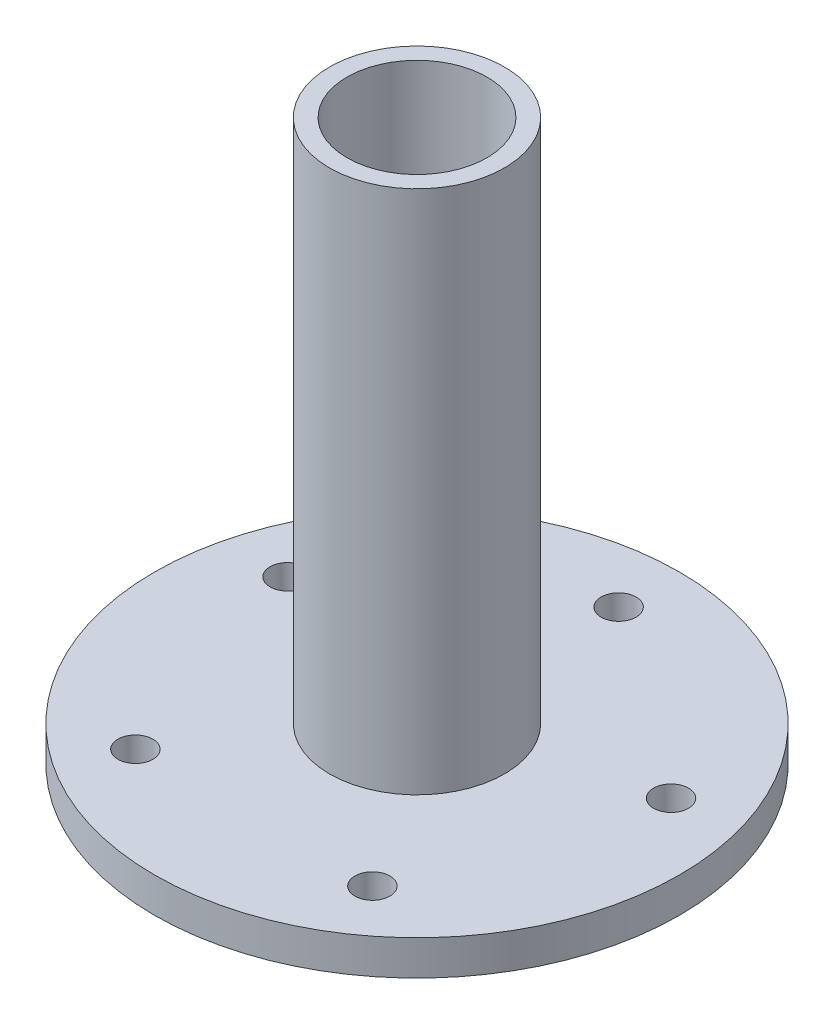
ISO-10303-21;
HEADER;
FILE_DESCRIPTION(('STEP AP214'),'2;1');
FILE_NAME('part.step','',(''),(''),'','','');
FILE_SCHEMA(('AUTOMOTIVE_DESIGN { 1 0 10303 214 1 1 1 1 }'));
ENDSEC;
DATA;
#1=APPLICATION_CONTEXT('core data for automotive mechanical design processes');
#2=APPLICATION_PROTOCOL_DEFINITION('international standard','automotive_design',2000,#1);
#3=PRODUCT_CONTEXT('',#1,'mechanical');
#4=PRODUCT('Part','Part','',(#3));
#5=PRODUCT_RELATED_PRODUCT_CATEGORY('part','',(#4));
#6=PRODUCT_DEFINITION_FORMATION('','',#4);
#7=PRODUCT_DEFINITION_CONTEXT('part definition',#1,'design');
#8=PRODUCT_DEFINITION('design','',#6,#7);
#9=PRODUCT_DEFINITION_SHAPE('','',#8);
#10=(LENGTH_UNIT() NAMED_UNIT(*) SI_UNIT(.MILLI.,.METRE.));
#11=(NAMED_UNIT(*) PLANE_ANGLE_UNIT() SI_UNIT($,.RADIAN.));
#12=(NAMED_UNIT(*) SI_UNIT($,.STERADIAN.) SOLID_ANGLE_UNIT());
#13=UNCERTAINTY_MEASURE_WITH_UNIT(LENGTH_MEASURE(1.E-05),#10,'distance_accuracy_value','');
#14=(GEOMETRIC_REPRESENTATION_CONTEXT(3) GLOBAL_UNCERTAINTY_ASSIGNED_CONTEXT((#13)) GLOBAL_UNIT_ASSIGNED_CONTEXT((#10,
#11,#12)) REPRESENTATION_CONTEXT('',''));
#15=CARTESIAN_POINT('',(0.,0.,0.));
#16=DIRECTION('',(0.,0.,1.));
#17=DIRECTION('',(1.,0.,0.));
#18=AXIS2_PLACEMENT_3D('',#15,#16,#17);
#19=CARTESIAN_POINT('',(0.,10.,0.));
#20=DIRECTION('',(0.,1.,0.));
#21=DIRECTION('',(0.,0.,1.));
#22=AXIS2_PLACEMENT_3D('',#19,#20,#21);
#23=PLANE('',#22);
#24=CARTESIAN_POINT('',(0.,10.,0.));
#25=DIRECTION('',(0.,1.,0.));
#26=DIRECTION('',(0.,0.,1.));
#27=AXIS2_PLACEMENT_3D('',#24,#25,#26);
#28=CIRCLE('',#27,75.);
#29=CARTESIAN_POINT('',(0.,10.,75.));
#30=VERTEX_POINT('',#29);
#31=EDGE_CURVE('E10',#30,#30,#28,.T.);
#32=ORIENTED_EDGE('',*,*,#31,.T.);
#33=EDGE_LOOP('',(#32));
#34=FACE_BOUND('',#33,.T.);
#35=CARTESIAN_POINT('',(-54.7949451338453,10.,-17.803956927986));
#36=DIRECTION('',(0.,1.,0.));
#37=DIRECTION('',(0.,0.,1.));
#38=AXIS2_PLACEMENT_3D('',#35,#36,#37);
#39=CIRCLE('',#38,5.00000000000292);
#40=CARTESIAN_POINT('',(-54.7949451338453,10.,-12.8039569279831));
#41=VERTEX_POINT('',#40);
#42=EDGE_CURVE('E51',#41,#41,#39,.T.);
#43=ORIENTED_EDGE('',*,*,#42,.F.);
#44=EDGE_LOOP('',(#43));
#45=FACE_BOUND('',#44,.T.);
#46=CARTESIAN_POINT('',(-33.8651385043987,10.,46.6113643717141));
#47=DIRECTION('',(0.,1.,0.));
#48=DIRECTION('',(0.,0.,1.));
#49=AXIS2_PLACEMENT_3D('',#46,#47,#48);
#50=CIRCLE('',#49,5.00000000000513);
#51=CARTESIAN_POINT('',(-33.8651385043987,10.,51.6113643717192));
#52=VERTEX_POINT('',#51);
#53=EDGE_CURVE('E58',#52,#52,#50,.T.);
#54=ORIENTED_EDGE('',*,*,#53,.F.);
#55=EDGE_LOOP('',(#54));
#56=FACE_BOUND('',#55,.T.);
#57=CARTESIAN_POINT('',(33.8651385044075,10.,46.6113643717112));
#58=DIRECTION('',(0.,1.,0.));
#59=DIRECTION('',(0.,0.,1.));
#60=AXIS2_PLACEMENT_3D('',#57,#58,#59);
#61=CIRCLE('',#60,5.00000000000412);
#62=CARTESIAN_POINT('',(33.8651385044075,10.,51.6113643717153));
#63=VERTEX_POINT('',#62);
#64=EDGE_CURVE('E64',#63,#63,#61,.T.);
#65=ORIENTED_EDGE('',*,*,#64,.F.);
#66=EDGE_LOOP('',(#65));
#67=FACE_BOUND('',#66,.T.);
#68=CARTESIAN_POINT('',(54.7949451338487,10.,-17.8039569279907));
#69=DIRECTION('',(0.,1.,0.));
#70=DIRECTION('',(0.,0.,1.));
#71=AXIS2_PLACEMENT_3D('',#68,#69,#70);
#72=CIRCLE('',#71,5.0000000000011);
#73=CARTESIAN_POINT('',(54.7949451338487,10.,-12.8039569279896));
#74=VERTEX_POINT('',#73);
#75=EDGE_CURVE('E70',#74,#74,#72,.T.);
#76=ORIENTED_EDGE('',*,*,#75,.F.);
#77=EDGE_LOOP('',(#76));
#78=FACE_BOUND('',#77,.T.);
#79=CARTESIAN_POINT('',(0.,10.,-57.6148148874486));
#80=DIRECTION('',(0.,1.,0.));
#81=DIRECTION('',(0.,0.,1.));
#82=AXIS2_PLACEMENT_3D('',#79,#80,#81);
#83=CIRCLE('',#82,5.);
#84=CARTESIAN_POINT('',(0.,10.,-52.6148148874486));
#85=VERTEX_POINT('',#84);
#86=EDGE_CURVE('E73',#85,#85,#83,.T.);
#87=ORIENTED_EDGE('',*,*,#86,.F.);
#88=EDGE_LOOP('',(#87));
#89=FACE_BOUND('',#88,.T.);
#90=CARTESIAN_POINT('',(0.,10.,0.));
#91=DIRECTION('',(0.,1.,0.));
#92=DIRECTION('',(0.,0.,1.));
#93=AXIS2_PLACEMENT_3D('',#90,#91,#92);
#94=CIRCLE('',#93,25.);
#95=CARTESIAN_POINT('',(0.,10.,25.));
#96=VERTEX_POINT('',#95);
#97=EDGE_CURVE('E81',#96,#96,#94,.T.);
#98=ORIENTED_EDGE('',*,*,#97,.F.);
#99=EDGE_LOOP('',(#98));
#100=FACE_BOUND('',#99,.T.);
#101=ADVANCED_FACE('F35',(#34,#45,#56,#67,#78,#89,#100),#23,.T.);
#102=CARTESIAN_POINT('',(0.,10.,0.));
#103=DIRECTION('',(0.,-1.,0.));
#104=DIRECTION('',(0.,0.,-1.));
#105=AXIS2_PLACEMENT_3D('',#102,#103,#104);
#106=CYLINDRICAL_SURFACE('',#105,75.);
#107=ORIENTED_EDGE('',*,*,#31,.F.);
#108=EDGE_LOOP('',(#107));
#109=FACE_BOUND('',#108,.T.);
#110=CARTESIAN_POINT('',(0.,0.,0.));
#111=DIRECTION('',(0.,1.,0.));
#112=DIRECTION('',(0.,0.,1.));
#113=AXIS2_PLACEMENT_3D('',#110,#111,#112);
#114=CIRCLE('',#113,75.);
#115=CARTESIAN_POINT('',(0.,0.,75.));
#116=VERTEX_POINT('',#115);
#117=EDGE_CURVE('E39',#116,#116,#114,.T.);
#118=ORIENTED_EDGE('',*,*,#117,.T.);
#119=EDGE_LOOP('',(#118));
#120=FACE_BOUND('',#119,.T.);
#121=ADVANCED_FACE('F37',(#109,#120),#106,.T.);
#122=CARTESIAN_POINT('',(0.,0.,0.));
#123=DIRECTION('',(0.,1.,0.));
#124=DIRECTION('',(0.,0.,1.));
#125=AXIS2_PLACEMENT_3D('',#122,#123,#124);
#126=PLANE('',#125);
#127=CARTESIAN_POINT('',(0.,0.,0.));
#128=DIRECTION('',(0.,1.,0.));
#129=DIRECTION('',(0.,0.,1.));
#130=AXIS2_PLACEMENT_3D('',#127,#128,#129);
#131=CIRCLE('',#130,20.);
#132=CARTESIAN_POINT('',(0.,0.,20.));
#133=VERTEX_POINT('',#132);
#134=EDGE_CURVE('E52',#133,#133,#131,.T.);
#135=ORIENTED_EDGE('',*,*,#134,.T.);
#136=EDGE_LOOP('',(#135));
#137=FACE_BOUND('',#136,.T.);
#138=CARTESIAN_POINT('',(0.,0.,-57.6148148874486));
#139=DIRECTION('',(0.,1.,0.));
#140=DIRECTION('',(0.,0.,1.));
#141=AXIS2_PLACEMENT_3D('',#138,#139,#140);
#142=CIRCLE('',#141,5.);
#143=CARTESIAN_POINT('',(0.,0.,-52.6148148874486));
#144=VERTEX_POINT('',#143);
#145=EDGE_CURVE('E46',#144,#144,#142,.T.);
#146=ORIENTED_EDGE('',*,*,#145,.T.);
#147=EDGE_LOOP('',(#146));
#148=FACE_BOUND('',#147,.T.);
#149=CARTESIAN_POINT('',(54.7949451338487,0.,-17.8039569279907));
#150=DIRECTION('',(0.,1.,0.));
#151=DIRECTION('',(0.,0.,1.));
#152=AXIS2_PLACEMENT_3D('',#149,#150,#151);
#153=CIRCLE('',#152,5.0000000000011);
#154=CARTESIAN_POINT('',(54.7949451338487,0.,-12.8039569279896));
#155=VERTEX_POINT('',#154);
#156=EDGE_CURVE('E67',#155,#155,#153,.T.);
#157=ORIENTED_EDGE('',*,*,#156,.T.);
#158=EDGE_LOOP('',(#157));
#159=FACE_BOUND('',#158,.T.);
#160=CARTESIAN_POINT('',(33.8651385044075,0.,46.6113643717112));
#161=DIRECTION('',(0.,1.,0.));
#162=DIRECTION('',(0.,0.,1.));
#163=AXIS2_PLACEMENT_3D('',#160,#161,#162);
#164=CIRCLE('',#163,5.00000000000412);
#165=CARTESIAN_POINT('',(33.8651385044075,0.,51.6113643717153));
#166=VERTEX_POINT('',#165);
#167=EDGE_CURVE('E61',#166,#166,#164,.T.);
#168=ORIENTED_EDGE('',*,*,#167,.T.);
#169=EDGE_LOOP('',(#168));
#170=FACE_BOUND('',#169,.T.);
#171=CARTESIAN_POINT('',(-33.8651385043987,0.,46.6113643717141));
#172=DIRECTION('',(0.,1.,0.));
#173=DIRECTION('',(0.,0.,1.));
#174=AXIS2_PLACEMENT_3D('',#171,#172,#173);
#175=CIRCLE('',#174,5.00000000000513);
#176=CARTESIAN_POINT('',(-33.8651385043987,0.,51.6113643717192));
#177=VERTEX_POINT('',#176);
#178=EDGE_CURVE('E55',#177,#177,#175,.T.);
#179=ORIENTED_EDGE('',*,*,#178,.T.);
#180=EDGE_LOOP('',(#179));
#181=FACE_BOUND('',#180,.T.);
#182=CARTESIAN_POINT('',(-54.7949451338453,0.,-17.803956927986));
#183=DIRECTION('',(0.,1.,0.));
#184=DIRECTION('',(0.,0.,1.));
#185=AXIS2_PLACEMENT_3D('',#182,#183,#184);
#186=CIRCLE('',#185,5.00000000000292);
#187=CARTESIAN_POINT('',(-54.7949451338453,0.,-12.8039569279831));
#188=VERTEX_POINT('',#187);
#189=EDGE_CURVE('E48',#188,#188,#186,.T.);
#190=ORIENTED_EDGE('',*,*,#189,.T.);
#191=EDGE_LOOP('',(#190));
#192=FACE_BOUND('',#191,.T.);
#193=ORIENTED_EDGE('',*,*,#117,.F.);
#194=EDGE_LOOP('',(#193));
#195=FACE_BOUND('',#194,.T.);
#196=ADVANCED_FACE('F111',(#137,#148,#159,#170,#181,#192,#195),#126,.F.);
#197=CARTESIAN_POINT('',(-54.7949451338453,0.,-17.803956927986));
#198=DIRECTION('',(0.,1.,0.));
#199=DIRECTION('',(0.,0.,1.));
#200=AXIS2_PLACEMENT_3D('',#197,#198,#199);
#201=CYLINDRICAL_SURFACE('',#200,5.00000000000292);
#202=ORIENTED_EDGE('',*,*,#189,.F.);
#203=EDGE_LOOP('',(#202));
#204=FACE_BOUND('',#203,.T.);
#205=ORIENTED_EDGE('',*,*,#42,.T.);
#206=EDGE_LOOP('',(#205));
#207=FACE_BOUND('',#206,.T.);
#208=ADVANCED_FACE('F115',(#204,#207),#201,.F.);
#209=CARTESIAN_POINT('',(-33.8651385043987,0.,46.6113643717141));
#210=DIRECTION('',(0.,1.,0.));
#211=DIRECTION('',(0.,0.,1.));
#212=AXIS2_PLACEMENT_3D('',#209,#210,#211);
#213=CYLINDRICAL_SURFACE('',#212,5.00000000000513);
#214=ORIENTED_EDGE('',*,*,#178,.F.);
#215=EDGE_LOOP('',(#214));
#216=FACE_BOUND('',#215,.T.);
#217=ORIENTED_EDGE('',*,*,#53,.T.);
#218=EDGE_LOOP('',(#217));
#219=FACE_BOUND('',#218,.T.);
#220=ADVANCED_FACE('F122',(#216,#219),#213,.F.);
#221=CARTESIAN_POINT('',(33.8651385044075,0.,46.6113643717112));
#222=DIRECTION('',(0.,1.,0.));
#223=DIRECTION('',(0.,0.,1.));
#224=AXIS2_PLACEMENT_3D('',#221,#222,#223);
#225=CYLINDRICAL_SURFACE('',#224,5.00000000000412);
#226=ORIENTED_EDGE('',*,*,#167,.F.);
#227=EDGE_LOOP('',(#226));
#228=FACE_BOUND('',#227,.T.);
#229=ORIENTED_EDGE('',*,*,#64,.T.);
#230=EDGE_LOOP('',(#229));
#231=FACE_BOUND('',#230,.T.);
#232=ADVANCED_FACE('F159',(#228,#231),#225,.F.);
#233=CARTESIAN_POINT('',(54.7949451338487,0.,-17.8039569279907));
#234=DIRECTION('',(0.,1.,0.));
#235=DIRECTION('',(0.,0.,1.));
#236=AXIS2_PLACEMENT_3D('',#233,#234,#235);
#237=CYLINDRICAL_SURFACE('',#236,5.0000000000011);
#238=ORIENTED_EDGE('',*,*,#156,.F.);
#239=EDGE_LOOP('',(#238));
#240=FACE_BOUND('',#239,.T.);
#241=ORIENTED_EDGE('',*,*,#75,.T.);
#242=EDGE_LOOP('',(#241));
#243=FACE_BOUND('',#242,.T.);
#244=ADVANCED_FACE('F153',(#240,#243),#237,.F.);
#245=CARTESIAN_POINT('',(0.,0.,-57.6148148874486));
#246=DIRECTION('',(0.,1.,0.));
#247=DIRECTION('',(0.,0.,1.));
#248=AXIS2_PLACEMENT_3D('',#245,#246,#247);
#249=CYLINDRICAL_SURFACE('',#248,5.);
#250=ORIENTED_EDGE('',*,*,#145,.F.);
#251=EDGE_LOOP('',(#250));
#252=FACE_BOUND('',#251,.T.);
#253=ORIENTED_EDGE('',*,*,#86,.T.);
#254=EDGE_LOOP('',(#253));
#255=FACE_BOUND('',#254,.T.);
#256=ADVANCED_FACE('F103',(#252,#255),#249,.F.);
#257=CARTESIAN_POINT('',(0.,0.,0.));
#258=DIRECTION('',(0.,1.,0.));
#259=DIRECTION('',(0.,0.,1.));
#260=AXIS2_PLACEMENT_3D('',#257,#258,#259);
#261=CYLINDRICAL_SURFACE('',#260,20.);
#262=ORIENTED_EDGE('',*,*,#134,.F.);
#263=EDGE_LOOP('',(#262));
#264=FACE_BOUND('',#263,.T.);
#265=CARTESIAN_POINT('',(0.,160.,0.));
#266=DIRECTION('',(0.,1.,0.));
#267=DIRECTION('',(0.,0.,1.));
#268=AXIS2_PLACEMENT_3D('',#265,#266,#267);
#269=CIRCLE('',#268,20.);
#270=CARTESIAN_POINT('',(0.,160.,20.));
#271=VERTEX_POINT('',#270);
#272=EDGE_CURVE('E84',#271,#271,#269,.T.);
#273=ORIENTED_EDGE('',*,*,#272,.T.);
#274=EDGE_LOOP('',(#273));
#275=FACE_BOUND('',#274,.T.);
#276=ADVANCED_FACE('F90',(#264,#275),#261,.F.);
#277=CARTESIAN_POINT('',(0.,160.,0.));
#278=DIRECTION('',(0.,1.,0.));
#279=DIRECTION('',(0.,0.,1.));
#280=AXIS2_PLACEMENT_3D('',#277,#278,#279);
#281=PLANE('',#280);
#282=CARTESIAN_POINT('',(0.,160.,0.));
#283=DIRECTION('',(0.,1.,0.));
#284=DIRECTION('',(0.,0.,1.));
#285=AXIS2_PLACEMENT_3D('',#282,#283,#284);
#286=CIRCLE('',#285,25.);
#287=CARTESIAN_POINT('',(0.,160.,25.));
#288=VERTEX_POINT('',#287);
#289=EDGE_CURVE('E80',#288,#288,#286,.T.);
#290=ORIENTED_EDGE('',*,*,#289,.T.);
#291=EDGE_LOOP('',(#290));
#292=FACE_BOUND('',#291,.T.);
#293=ORIENTED_EDGE('',*,*,#272,.F.);
#294=EDGE_LOOP('',(#293));
#295=FACE_BOUND('',#294,.T.);
#296=ADVANCED_FACE('F92',(#292,#295),#281,.T.);
#297=CARTESIAN_POINT('',(0.,160.,0.));
#298=DIRECTION('',(0.,-1.,0.));
#299=DIRECTION('',(0.,0.,-1.));
#300=AXIS2_PLACEMENT_3D('',#297,#298,#299);
#301=CYLINDRICAL_SURFACE('',#300,25.);
#302=ORIENTED_EDGE('',*,*,#289,.F.);
#303=EDGE_LOOP('',(#302));
#304=FACE_BOUND('',#303,.T.);
#305=ORIENTED_EDGE('',*,*,#97,.T.);
#306=EDGE_LOOP('',(#305));
#307=FACE_BOUND('',#306,.T.);
#308=ADVANCED_FACE('F94',(#304,#307),#301,.T.);
#309=CLOSED_SHELL('',(#101,#121,#196,#208,#220,#232,#244,#256,#276,#296,#308));
#310=MANIFOLD_SOLID_BREP('B2',#309);
#311=ADVANCED_BREP_SHAPE_REPRESENTATION('',(#18,#310),#14);
#312=SHAPE_DEFINITION_REPRESENTATION(#9,#311);
ENDSEC;
END-ISO-10303-21;
